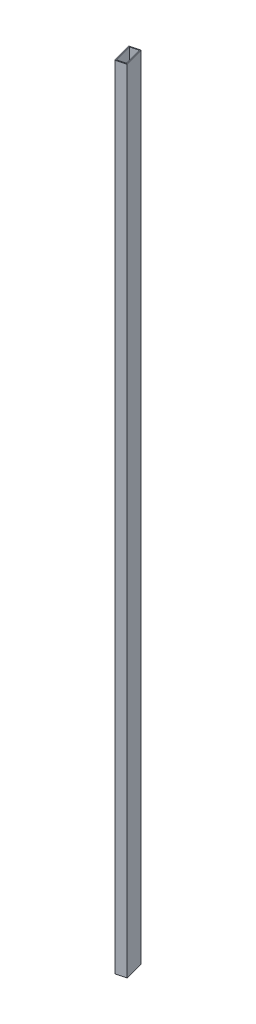
ISO-10303-21;
HEADER;
FILE_DESCRIPTION(('STEP AP214'),'2;1');
FILE_NAME('part.step','',(''),(''),'','','');
FILE_SCHEMA(('AUTOMOTIVE_DESIGN { 1 0 10303 214 1 1 1 1 }'));
ENDSEC;
DATA;
#1=APPLICATION_CONTEXT('core data for automotive mechanical design processes');
#2=APPLICATION_PROTOCOL_DEFINITION('international standard','automotive_design',2000,#1);
#3=PRODUCT_CONTEXT('',#1,'mechanical');
#4=PRODUCT('Part','Part','',(#3));
#5=PRODUCT_RELATED_PRODUCT_CATEGORY('part','',(#4));
#6=PRODUCT_DEFINITION_FORMATION('','',#4);
#7=PRODUCT_DEFINITION_CONTEXT('part definition',#1,'design');
#8=PRODUCT_DEFINITION('design','',#6,#7);
#9=PRODUCT_DEFINITION_SHAPE('','',#8);
#10=(LENGTH_UNIT() NAMED_UNIT(*) SI_UNIT(.MILLI.,.METRE.));
#11=(NAMED_UNIT(*) PLANE_ANGLE_UNIT() SI_UNIT($,.RADIAN.));
#12=(NAMED_UNIT(*) SI_UNIT($,.STERADIAN.) SOLID_ANGLE_UNIT());
#13=UNCERTAINTY_MEASURE_WITH_UNIT(LENGTH_MEASURE(1.E-05),#10,'distance_accuracy_value','');
#14=(GEOMETRIC_REPRESENTATION_CONTEXT(3) GLOBAL_UNCERTAINTY_ASSIGNED_CONTEXT((#13)) GLOBAL_UNIT_ASSIGNED_CONTEXT((#10,
#11,#12)) REPRESENTATION_CONTEXT('',''));
#15=CARTESIAN_POINT('',(0.,0.,0.));
#16=DIRECTION('',(0.,0.,1.));
#17=DIRECTION('',(1.,0.,0.));
#18=AXIS2_PLACEMENT_3D('',#15,#16,#17);
#19=CARTESIAN_POINT('',(-1047.998002989,1975.,2900.856237034));
#20=DIRECTION('',(0.,1.,0.));
#21=DIRECTION('',(1.,0.,0.));
#22=AXIS2_PLACEMENT_3D('',#19,#20,#21);
#23=PLANE('',#22);
#24=DIRECTION('',(0.258819045102985,0.,0.965925826288944));
#25=VECTOR('',#24,1.);
#26=CARTESIAN_POINT('',(-1080.188121416,1975.,2861.858848972));
#27=LINE('',#26,#25);
#28=CARTESIAN_POINT('',(-1080.188121416,1975.,2861.858848972));
#29=VERTEX_POINT('',#28);
#30=CARTESIAN_POINT('',(-1056.376769267,1975.,2950.724024991));
#31=VERTEX_POINT('',#30);
#32=EDGE_CURVE('E102',#29,#31,#27,.T.);
#33=ORIENTED_EDGE('',*,*,#32,.F.);
#34=DIRECTION('',(-0.965925826288944,0.,0.258819045102985));
#35=VECTOR('',#34,1.);
#36=CARTESIAN_POINT('',(-1039.619236712,1975.,2850.988449078));
#37=LINE('',#36,#35);
#38=CARTESIAN_POINT('',(-1039.619236712,1975.,2850.988449078));
#39=VERTEX_POINT('',#38);
#40=EDGE_CURVE('E89',#39,#29,#37,.T.);
#41=ORIENTED_EDGE('',*,*,#40,.F.);
#42=DIRECTION('',(-0.258819045102985,0.,-0.965925826288944));
#43=VECTOR('',#42,1.);
#44=CARTESIAN_POINT('',(-1015.807884563,1975.,2939.853625096));
#45=LINE('',#44,#43);
#46=CARTESIAN_POINT('',(-1015.807884563,1975.,2939.853625096));
#47=VERTEX_POINT('',#46);
#48=EDGE_CURVE('E132',#47,#39,#45,.T.);
#49=ORIENTED_EDGE('',*,*,#48,.F.);
#50=DIRECTION('',(0.965925826288944,0.,-0.258819045102985));
#51=VECTOR('',#50,1.);
#52=CARTESIAN_POINT('',(-1056.376769267,1975.,2950.724024991));
#53=LINE('',#52,#51);
#54=EDGE_CURVE('E20',#31,#47,#53,.T.);
#55=ORIENTED_EDGE('',*,*,#54,.F.);
#56=EDGE_LOOP('',(#33,#41,#49,#55));
#57=FACE_BOUND('',#56,.T.);
#58=DIRECTION('',(0.965925826288944,0.,-0.258819045102985));
#59=VECTOR('',#58,1.);
#60=CARTESIAN_POINT('',(-1059.205196392,1975.,2955.623004476));
#61=LINE('',#60,#59);
#62=CARTESIAN_POINT('',(-1059.205196392,1975.,2955.623004476));
#63=VERTEX_POINT('',#62);
#64=CARTESIAN_POINT('',(-1010.908905077,1975.,2942.682052221));
#65=VERTEX_POINT('',#64);
#66=EDGE_CURVE('E247',#63,#65,#61,.T.);
#67=ORIENTED_EDGE('',*,*,#66,.T.);
#68=DIRECTION('',(-0.258819045102985,0.,-0.965925826288944));
#69=VECTOR('',#68,1.);
#70=CARTESIAN_POINT('',(-1010.908905077,1975.,2942.682052221));
#71=LINE('',#70,#69);
#72=CARTESIAN_POINT('',(-1036.790809587,1975.,2846.089469592));
#73=VERTEX_POINT('',#72);
#74=EDGE_CURVE('E243',#65,#73,#71,.T.);
#75=ORIENTED_EDGE('',*,*,#74,.T.);
#76=DIRECTION('',(-0.965925826288944,0.,0.258819045102985));
#77=VECTOR('',#76,1.);
#78=CARTESIAN_POINT('',(-1036.790809587,1975.,2846.089469592));
#79=LINE('',#78,#77);
#80=CARTESIAN_POINT('',(-1085.087100902,1975.,2859.030421847));
#81=VERTEX_POINT('',#80);
#82=EDGE_CURVE('E272',#73,#81,#79,.T.);
#83=ORIENTED_EDGE('',*,*,#82,.T.);
#84=DIRECTION('',(0.258819045102985,0.,0.965925826288944));
#85=VECTOR('',#84,1.);
#86=CARTESIAN_POINT('',(-1085.087100902,1975.,2859.030421847));
#87=LINE('',#86,#85);
#88=EDGE_CURVE('E114',#81,#63,#87,.T.);
#89=ORIENTED_EDGE('',*,*,#88,.T.);
#90=EDGE_LOOP('',(#67,#75,#83,#89));
#91=FACE_BOUND('',#90,.T.);
#92=ADVANCED_FACE('F17',(#57,#91),#23,.T.);
#93=CARTESIAN_POINT('',(-1047.998002989,-1975.,2900.856237034));
#94=DIRECTION('',(0.,1.,0.));
#95=DIRECTION('',(1.,0.,0.));
#96=AXIS2_PLACEMENT_3D('',#93,#94,#95);
#97=PLANE('',#96);
#98=DIRECTION('',(0.965925826288944,0.,-0.258819045102985));
#99=VECTOR('',#98,1.);
#100=CARTESIAN_POINT('',(-1056.376769267,-1975.,2950.724024991));
#101=LINE('',#100,#99);
#102=CARTESIAN_POINT('',(-1056.376769267,-1975.,2950.724024991));
#103=VERTEX_POINT('',#102);
#104=CARTESIAN_POINT('',(-1015.807884563,-1975.,2939.853625096));
#105=VERTEX_POINT('',#104);
#106=EDGE_CURVE('E11',#103,#105,#101,.T.);
#107=ORIENTED_EDGE('',*,*,#106,.T.);
#108=DIRECTION('',(-0.258819045102985,0.,-0.965925826288944));
#109=VECTOR('',#108,1.);
#110=CARTESIAN_POINT('',(-1015.807884563,-1975.,2939.853625096));
#111=LINE('',#110,#109);
#112=CARTESIAN_POINT('',(-1039.619236712,-1975.,2850.988449078));
#113=VERTEX_POINT('',#112);
#114=EDGE_CURVE('E134',#105,#113,#111,.T.);
#115=ORIENTED_EDGE('',*,*,#114,.T.);
#116=DIRECTION('',(-0.965925826288944,0.,0.258819045102985));
#117=VECTOR('',#116,1.);
#118=CARTESIAN_POINT('',(-1039.619236712,-1975.,2850.988449078));
#119=LINE('',#118,#117);
#120=CARTESIAN_POINT('',(-1080.188121416,-1975.,2861.858848972));
#121=VERTEX_POINT('',#120);
#122=EDGE_CURVE('E99',#113,#121,#119,.T.);
#123=ORIENTED_EDGE('',*,*,#122,.T.);
#124=DIRECTION('',(0.258819045102985,0.,0.965925826288944));
#125=VECTOR('',#124,1.);
#126=CARTESIAN_POINT('',(-1080.188121416,-1975.,2861.858848972));
#127=LINE('',#126,#125);
#128=EDGE_CURVE('E112',#121,#103,#127,.T.);
#129=ORIENTED_EDGE('',*,*,#128,.T.);
#130=EDGE_LOOP('',(#107,#115,#123,#129));
#131=FACE_BOUND('',#130,.T.);
#132=DIRECTION('',(0.258819045102985,0.,0.965925826288944));
#133=VECTOR('',#132,1.);
#134=CARTESIAN_POINT('',(-1085.087100902,-1975.,2859.030421847));
#135=LINE('',#134,#133);
#136=CARTESIAN_POINT('',(-1085.087100902,-1975.,2859.030421847));
#137=VERTEX_POINT('',#136);
#138=CARTESIAN_POINT('',(-1059.205196392,-1975.,2955.623004476));
#139=VERTEX_POINT('',#138);
#140=EDGE_CURVE('E120',#137,#139,#135,.T.);
#141=ORIENTED_EDGE('',*,*,#140,.F.);
#142=DIRECTION('',(-0.965925826288944,0.,0.258819045102985));
#143=VECTOR('',#142,1.);
#144=CARTESIAN_POINT('',(-1036.790809587,-1975.,2846.089469592));
#145=LINE('',#144,#143);
#146=CARTESIAN_POINT('',(-1036.790809587,-1975.,2846.089469592));
#147=VERTEX_POINT('',#146);
#148=EDGE_CURVE('E233',#147,#137,#145,.T.);
#149=ORIENTED_EDGE('',*,*,#148,.F.);
#150=DIRECTION('',(-0.258819045102985,0.,-0.965925826288944));
#151=VECTOR('',#150,1.);
#152=CARTESIAN_POINT('',(-1010.908905077,-1975.,2942.682052221));
#153=LINE('',#152,#151);
#154=CARTESIAN_POINT('',(-1010.908905077,-1975.,2942.682052221));
#155=VERTEX_POINT('',#154);
#156=EDGE_CURVE('E228',#155,#147,#153,.T.);
#157=ORIENTED_EDGE('',*,*,#156,.F.);
#158=DIRECTION('',(0.965925826288944,0.,-0.258819045102985));
#159=VECTOR('',#158,1.);
#160=CARTESIAN_POINT('',(-1059.205196392,-1975.,2955.623004476));
#161=LINE('',#160,#159);
#162=EDGE_CURVE('E231',#139,#155,#161,.T.);
#163=ORIENTED_EDGE('',*,*,#162,.F.);
#164=EDGE_LOOP('',(#141,#149,#157,#163));
#165=FACE_BOUND('',#164,.T.);
#166=ADVANCED_FACE('F190',(#131,#165),#97,.F.);
#167=CARTESIAN_POINT('',(-1056.376769267,-1975.,2950.724024991));
#168=DIRECTION('',(-0.258819045102985,0.,-0.965925826288944));
#169=DIRECTION('',(-0.965925826288944,0.,0.258819045102985));
#170=AXIS2_PLACEMENT_3D('',#167,#168,#169);
#171=PLANE('',#170);
#172=DIRECTION('',(0.,1.,0.));
#173=VECTOR('',#172,1.);
#174=CARTESIAN_POINT('',(-1056.376769267,-1975.,2950.724024991));
#175=LINE('',#174,#173);
#176=EDGE_CURVE('E107',#103,#31,#175,.T.);
#177=ORIENTED_EDGE('',*,*,#176,.T.);
#178=ORIENTED_EDGE('',*,*,#54,.T.);
#179=DIRECTION('',(0.,1.,0.));
#180=VECTOR('',#179,1.);
#181=CARTESIAN_POINT('',(-1015.807884563,-1975.,2939.853625096));
#182=LINE('',#181,#180);
#183=EDGE_CURVE('E128',#105,#47,#182,.T.);
#184=ORIENTED_EDGE('',*,*,#183,.F.);
#185=ORIENTED_EDGE('',*,*,#106,.F.);
#186=EDGE_LOOP('',(#177,#178,#184,#185));
#187=FACE_BOUND('',#186,.T.);
#188=ADVANCED_FACE('F177',(#187),#171,.T.);
#189=CARTESIAN_POINT('',(-1015.807884563,-1975.,2939.853625096));
#190=DIRECTION('',(-0.965925826288944,0.,0.258819045102985));
#191=DIRECTION('',(0.,1.,0.));
#192=AXIS2_PLACEMENT_3D('',#189,#190,#191);
#193=PLANE('',#192);
#194=ORIENTED_EDGE('',*,*,#183,.T.);
#195=ORIENTED_EDGE('',*,*,#48,.T.);
#196=DIRECTION('',(0.,1.,0.));
#197=VECTOR('',#196,1.);
#198=CARTESIAN_POINT('',(-1039.619236712,-1975.,2850.988449078));
#199=LINE('',#198,#197);
#200=EDGE_CURVE('E96',#113,#39,#199,.T.);
#201=ORIENTED_EDGE('',*,*,#200,.F.);
#202=ORIENTED_EDGE('',*,*,#114,.F.);
#203=EDGE_LOOP('',(#194,#195,#201,#202));
#204=FACE_BOUND('',#203,.T.);
#205=ADVANCED_FACE('F172',(#204),#193,.T.);
#206=CARTESIAN_POINT('',(-1039.619236712,-1975.,2850.988449078));
#207=DIRECTION('',(0.258819045102985,0.,0.965925826288944));
#208=DIRECTION('',(0.,-1.,0.));
#209=AXIS2_PLACEMENT_3D('',#206,#207,#208);
#210=PLANE('',#209);
#211=ORIENTED_EDGE('',*,*,#200,.T.);
#212=ORIENTED_EDGE('',*,*,#40,.T.);
#213=DIRECTION('',(0.,1.,0.));
#214=VECTOR('',#213,1.);
#215=CARTESIAN_POINT('',(-1080.188121416,-1975.,2861.858848972));
#216=LINE('',#215,#214);
#217=EDGE_CURVE('E94',#121,#29,#216,.T.);
#218=ORIENTED_EDGE('',*,*,#217,.F.);
#219=ORIENTED_EDGE('',*,*,#122,.F.);
#220=EDGE_LOOP('',(#211,#212,#218,#219));
#221=FACE_BOUND('',#220,.T.);
#222=ADVANCED_FACE('F91',(#221),#210,.T.);
#223=CARTESIAN_POINT('',(-1080.188121416,-1975.,2861.858848972));
#224=DIRECTION('',(0.965925826288944,0.,-0.258819045102985));
#225=DIRECTION('',(0.,-1.,0.));
#226=AXIS2_PLACEMENT_3D('',#223,#224,#225);
#227=PLANE('',#226);
#228=ORIENTED_EDGE('',*,*,#217,.T.);
#229=ORIENTED_EDGE('',*,*,#32,.T.);
#230=ORIENTED_EDGE('',*,*,#176,.F.);
#231=ORIENTED_EDGE('',*,*,#128,.F.);
#232=EDGE_LOOP('',(#228,#229,#230,#231));
#233=FACE_BOUND('',#232,.T.);
#234=ADVANCED_FACE('F110',(#233),#227,.T.);
#235=CARTESIAN_POINT('',(-1085.087100902,-1975.,2859.030421847));
#236=DIRECTION('',(0.965925826288944,0.,-0.258819045102985));
#237=DIRECTION('',(0.,-1.,0.));
#238=AXIS2_PLACEMENT_3D('',#235,#236,#237);
#239=PLANE('',#238);
#240=ORIENTED_EDGE('',*,*,#140,.T.);
#241=DIRECTION('',(0.,1.,0.));
#242=VECTOR('',#241,1.);
#243=CARTESIAN_POINT('',(-1059.205196392,-1975.,2955.623004476));
#244=LINE('',#243,#242);
#245=EDGE_CURVE('E238',#139,#63,#244,.T.);
#246=ORIENTED_EDGE('',*,*,#245,.T.);
#247=ORIENTED_EDGE('',*,*,#88,.F.);
#248=DIRECTION('',(0.,1.,0.));
#249=VECTOR('',#248,1.);
#250=CARTESIAN_POINT('',(-1085.087100902,-1975.,2859.030421847));
#251=LINE('',#250,#249);
#252=EDGE_CURVE('E269',#137,#81,#251,.T.);
#253=ORIENTED_EDGE('',*,*,#252,.F.);
#254=EDGE_LOOP('',(#240,#246,#247,#253));
#255=FACE_BOUND('',#254,.T.);
#256=ADVANCED_FACE('F167',(#255),#239,.F.);
#257=CARTESIAN_POINT('',(-1036.790809587,-1975.,2846.089469592));
#258=DIRECTION('',(0.258819045102985,0.,0.965925826288944));
#259=DIRECTION('',(0.,-1.,0.));
#260=AXIS2_PLACEMENT_3D('',#257,#258,#259);
#261=PLANE('',#260);
#262=ORIENTED_EDGE('',*,*,#148,.T.);
#263=ORIENTED_EDGE('',*,*,#252,.T.);
#264=ORIENTED_EDGE('',*,*,#82,.F.);
#265=DIRECTION('',(0.,1.,0.));
#266=VECTOR('',#265,1.);
#267=CARTESIAN_POINT('',(-1036.790809587,-1975.,2846.089469592));
#268=LINE('',#267,#266);
#269=EDGE_CURVE('E237',#147,#73,#268,.T.);
#270=ORIENTED_EDGE('',*,*,#269,.F.);
#271=EDGE_LOOP('',(#262,#263,#264,#270));
#272=FACE_BOUND('',#271,.T.);
#273=ADVANCED_FACE('F159',(#272),#261,.F.);
#274=CARTESIAN_POINT('',(-1010.908905077,-1975.,2942.682052221));
#275=DIRECTION('',(-0.965925826288944,0.,0.258819045102985));
#276=DIRECTION('',(0.,1.,0.));
#277=AXIS2_PLACEMENT_3D('',#274,#275,#276);
#278=PLANE('',#277);
#279=ORIENTED_EDGE('',*,*,#156,.T.);
#280=ORIENTED_EDGE('',*,*,#269,.T.);
#281=ORIENTED_EDGE('',*,*,#74,.F.);
#282=DIRECTION('',(0.,1.,0.));
#283=VECTOR('',#282,1.);
#284=CARTESIAN_POINT('',(-1010.908905077,-1975.,2942.682052221));
#285=LINE('',#284,#283);
#286=EDGE_CURVE('E241',#155,#65,#285,.T.);
#287=ORIENTED_EDGE('',*,*,#286,.F.);
#288=EDGE_LOOP('',(#279,#280,#281,#287));
#289=FACE_BOUND('',#288,.T.);
#290=ADVANCED_FACE('F150',(#289),#278,.F.);
#291=CARTESIAN_POINT('',(-1059.205196392,-1975.,2955.623004476));
#292=DIRECTION('',(-0.258819045102985,0.,-0.965925826288944));
#293=DIRECTION('',(-0.965925826288944,0.,0.258819045102985));
#294=AXIS2_PLACEMENT_3D('',#291,#292,#293);
#295=PLANE('',#294);
#296=ORIENTED_EDGE('',*,*,#162,.T.);
#297=ORIENTED_EDGE('',*,*,#286,.T.);
#298=ORIENTED_EDGE('',*,*,#66,.F.);
#299=ORIENTED_EDGE('',*,*,#245,.F.);
#300=EDGE_LOOP('',(#296,#297,#298,#299));
#301=FACE_BOUND('',#300,.T.);
#302=ADVANCED_FACE('F145',(#301),#295,.F.);
#303=CLOSED_SHELL('',(#92,#166,#188,#205,#222,#234,#256,#273,#290,#302));
#304=MANIFOLD_SOLID_BREP('B1',#303);
#305=ADVANCED_BREP_SHAPE_REPRESENTATION('',(#18,#304),#14);
#306=SHAPE_DEFINITION_REPRESENTATION(#9,#305);
ENDSEC;
END-ISO-10303-21;
